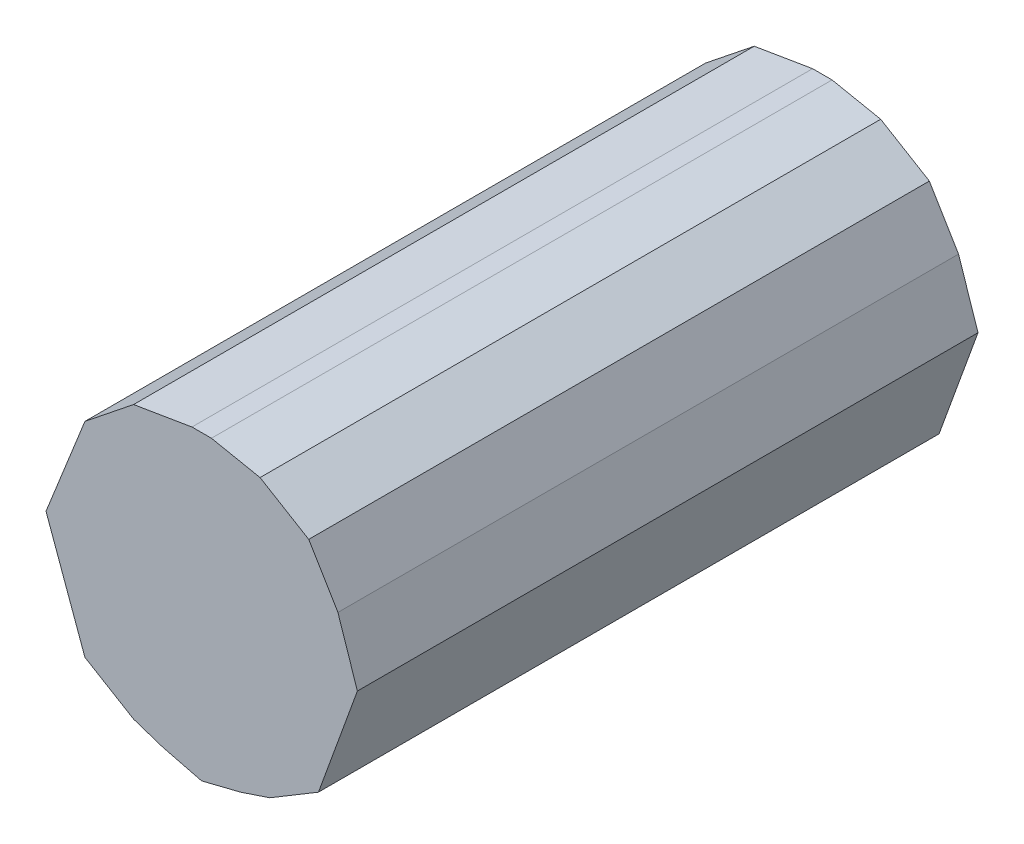
ISO-10303-21;
HEADER;
FILE_DESCRIPTION(('STEP AP214'),'2;1');
FILE_NAME('part.step','',(''),(''),'','','');
FILE_SCHEMA(('AUTOMOTIVE_DESIGN { 1 0 10303 214 1 1 1 1 }'));
ENDSEC;
DATA;
#1=APPLICATION_CONTEXT('core data for automotive mechanical design processes');
#2=APPLICATION_PROTOCOL_DEFINITION('international standard','automotive_design',2000,#1);
#3=PRODUCT_CONTEXT('',#1,'mechanical');
#4=PRODUCT('Part','Part','',(#3));
#5=PRODUCT_RELATED_PRODUCT_CATEGORY('part','',(#4));
#6=PRODUCT_DEFINITION_FORMATION('','',#4);
#7=PRODUCT_DEFINITION_CONTEXT('part definition',#1,'design');
#8=PRODUCT_DEFINITION('design','',#6,#7);
#9=PRODUCT_DEFINITION_SHAPE('','',#8);
#10=(LENGTH_UNIT() NAMED_UNIT(*) SI_UNIT(.MILLI.,.METRE.));
#11=(NAMED_UNIT(*) PLANE_ANGLE_UNIT() SI_UNIT($,.RADIAN.));
#12=(NAMED_UNIT(*) SI_UNIT($,.STERADIAN.) SOLID_ANGLE_UNIT());
#13=UNCERTAINTY_MEASURE_WITH_UNIT(LENGTH_MEASURE(1.E-05),#10,'distance_accuracy_value','');
#14=(GEOMETRIC_REPRESENTATION_CONTEXT(3) GLOBAL_UNCERTAINTY_ASSIGNED_CONTEXT((#13)) GLOBAL_UNIT_ASSIGNED_CONTEXT((#10,
#11,#12)) REPRESENTATION_CONTEXT('',''));
#15=CARTESIAN_POINT('',(0.,0.,0.));
#16=DIRECTION('',(0.,0.,1.));
#17=DIRECTION('',(1.,0.,0.));
#18=AXIS2_PLACEMENT_3D('',#15,#16,#17);
#19=CARTESIAN_POINT('',(-1.524,1.3335,0.));
#20=DIRECTION('',(0.928476690885259,-0.371390676354104,0.));
#21=DIRECTION('',(0.371390676354104,0.928476690885259,0.));
#22=AXIS2_PLACEMENT_3D('',#19,#20,#21);
#23=PLANE('',#22);
#24=DIRECTION('',(0.,0.,1.));
#25=VECTOR('',#24,1.);
#26=CARTESIAN_POINT('',(-2.032,0.0635,0.));
#27=LINE('',#26,#25);
#28=CARTESIAN_POINT('',(-2.032,0.0635,0.));
#29=VERTEX_POINT('',#28);
#30=CARTESIAN_POINT('',(-2.032,0.0635,8.1));
#31=VERTEX_POINT('',#30);
#32=EDGE_CURVE('E141',#29,#31,#27,.T.);
#33=ORIENTED_EDGE('',*,*,#32,.T.);
#34=DIRECTION('',(0.371390676354104,0.928476690885259,0.));
#35=VECTOR('',#34,1.);
#36=CARTESIAN_POINT('',(-1.524,1.3335,8.1));
#37=LINE('',#36,#35);
#38=CARTESIAN_POINT('',(-1.52400000000004,1.33350000000005,8.1));
#39=VERTEX_POINT('',#38);
#40=EDGE_CURVE('E20',#39,#31,#37,.F.);
#41=ORIENTED_EDGE('',*,*,#40,.F.);
#42=DIRECTION('',(0.,0.,1.));
#43=VECTOR('',#42,1.);
#44=CARTESIAN_POINT('',(-1.52400000000016,1.3335000000002,0.));
#45=LINE('',#44,#43);
#46=CARTESIAN_POINT('',(-1.52400000000004,1.33350000000005,0.));
#47=VERTEX_POINT('',#46);
#48=EDGE_CURVE('E151',#39,#47,#45,.F.);
#49=ORIENTED_EDGE('',*,*,#48,.T.);
#50=DIRECTION('',(0.371390676354104,0.928476690885259,0.));
#51=VECTOR('',#50,1.);
#52=CARTESIAN_POINT('',(-1.524,1.3335,0.));
#53=LINE('',#52,#51);
#54=EDGE_CURVE('E126',#29,#47,#53,.T.);
#55=ORIENTED_EDGE('',*,*,#54,.F.);
#56=EDGE_LOOP('',(#33,#41,#49,#55));
#57=FACE_BOUND('',#56,.T.);
#58=ADVANCED_FACE('F17',(#57),#23,.F.);
#59=CARTESIAN_POINT('',(-2.032,0.0635,0.));
#60=DIRECTION('',(0.939793423488291,0.341743063087106,0.));
#61=DIRECTION('',(-0.341743063087106,0.939793423488291,0.));
#62=AXIS2_PLACEMENT_3D('',#59,#60,#61);
#63=PLANE('',#62);
#64=DIRECTION('',(0.,0.,1.));
#65=VECTOR('',#64,1.);
#66=CARTESIAN_POINT('',(-1.524,-1.3335,0.));
#67=LINE('',#66,#65);
#68=CARTESIAN_POINT('',(-1.5239999999997,-1.33349999999989,0.));
#69=VERTEX_POINT('',#68);
#70=CARTESIAN_POINT('',(-1.5239999999997,-1.33349999999989,8.1));
#71=VERTEX_POINT('',#70);
#72=EDGE_CURVE('E144',#69,#71,#67,.T.);
#73=ORIENTED_EDGE('',*,*,#72,.T.);
#74=DIRECTION('',(-0.341743063087106,0.939793423488291,0.));
#75=VECTOR('',#74,1.);
#76=CARTESIAN_POINT('',(-2.032,0.0635,8.1));
#77=LINE('',#76,#75);
#78=EDGE_CURVE('E133',#31,#71,#77,.F.);
#79=ORIENTED_EDGE('',*,*,#78,.F.);
#80=ORIENTED_EDGE('',*,*,#32,.F.);
#81=DIRECTION('',(-0.341743063087106,0.939793423488291,0.));
#82=VECTOR('',#81,1.);
#83=CARTESIAN_POINT('',(-2.032,0.0635,0.));
#84=LINE('',#83,#82);
#85=EDGE_CURVE('E145',#69,#29,#84,.T.);
#86=ORIENTED_EDGE('',*,*,#85,.F.);
#87=EDGE_LOOP('',(#73,#79,#80,#86));
#88=FACE_BOUND('',#87,.T.);
#89=ADVANCED_FACE('F140',(#88),#63,.F.);
#90=CARTESIAN_POINT('',(-0.889,1.8415,0.));
#91=DIRECTION('',(0.62469504755418,-0.780868809443225,0.));
#92=DIRECTION('',(0.780868809443225,0.62469504755418,0.));
#93=AXIS2_PLACEMENT_3D('',#90,#91,#92);
#94=PLANE('',#93);
#95=ORIENTED_EDGE('',*,*,#48,.F.);
#96=DIRECTION('',(0.780868809443225,0.62469504755418,0.));
#97=VECTOR('',#96,1.);
#98=CARTESIAN_POINT('',(-0.889,1.8415,8.1));
#99=LINE('',#98,#97);
#100=CARTESIAN_POINT('',(-0.88900000000001,1.84150000000006,8.1));
#101=VERTEX_POINT('',#100);
#102=EDGE_CURVE('E136',#101,#39,#99,.F.);
#103=ORIENTED_EDGE('',*,*,#102,.F.);
#104=DIRECTION('',(0.,0.,1.));
#105=VECTOR('',#104,1.);
#106=CARTESIAN_POINT('',(-0.889000000000042,1.84150000000025,0.));
#107=LINE('',#106,#105);
#108=CARTESIAN_POINT('',(-0.88900000000001,1.84150000000006,0.));
#109=VERTEX_POINT('',#108);
#110=EDGE_CURVE('E163',#101,#109,#107,.F.);
#111=ORIENTED_EDGE('',*,*,#110,.T.);
#112=DIRECTION('',(0.780868809443225,0.62469504755418,0.));
#113=VECTOR('',#112,1.);
#114=CARTESIAN_POINT('',(-0.889,1.8415,0.));
#115=LINE('',#114,#113);
#116=EDGE_CURVE('E153',#47,#109,#115,.T.);
#117=ORIENTED_EDGE('',*,*,#116,.F.);
#118=EDGE_LOOP('',(#95,#103,#111,#117));
#119=FACE_BOUND('',#118,.T.);
#120=ADVANCED_FACE('F321',(#119),#94,.F.);
#121=CARTESIAN_POINT('',(-1.524,-1.3335,0.));
#122=DIRECTION('',(0.514495755428115,0.857492925712191,0.));
#123=DIRECTION('',(-0.857492925712191,0.514495755428115,0.));
#124=AXIS2_PLACEMENT_3D('',#121,#122,#123);
#125=PLANE('',#124);
#126=DIRECTION('',(0.,0.,1.));
#127=VECTOR('',#126,1.);
#128=CARTESIAN_POINT('',(-0.889,-1.7145,0.));
#129=LINE('',#128,#127);
#130=CARTESIAN_POINT('',(-0.88900000000013,-1.71450000000022,0.));
#131=VERTEX_POINT('',#130);
#132=CARTESIAN_POINT('',(-0.88900000000013,-1.71450000000022,8.1));
#133=VERTEX_POINT('',#132);
#134=EDGE_CURVE('E168',#131,#133,#129,.T.);
#135=ORIENTED_EDGE('',*,*,#134,.T.);
#136=DIRECTION('',(-0.857492925712191,0.514495755428115,0.));
#137=VECTOR('',#136,1.);
#138=CARTESIAN_POINT('',(-1.524,-1.3335,8.1));
#139=LINE('',#138,#137);
#140=EDGE_CURVE('E156',#71,#133,#139,.F.);
#141=ORIENTED_EDGE('',*,*,#140,.F.);
#142=ORIENTED_EDGE('',*,*,#72,.F.);
#143=DIRECTION('',(-0.857492925712191,0.514495755428115,0.));
#144=VECTOR('',#143,1.);
#145=CARTESIAN_POINT('',(-1.524,-1.3335,0.));
#146=LINE('',#145,#144);
#147=EDGE_CURVE('E158',#131,#69,#146,.T.);
#148=ORIENTED_EDGE('',*,*,#147,.F.);
#149=EDGE_LOOP('',(#135,#141,#142,#148));
#150=FACE_BOUND('',#149,.T.);
#151=ADVANCED_FACE('F317',(#150),#125,.F.);
#152=CARTESIAN_POINT('',(-0.127,1.9685,0.));
#153=DIRECTION('',(0.164398987305033,-0.986393923832198,0.));
#154=DIRECTION('',(0.986393923832198,0.164398987305033,0.));
#155=AXIS2_PLACEMENT_3D('',#152,#153,#154);
#156=PLANE('',#155);
#157=ORIENTED_EDGE('',*,*,#110,.F.);
#158=DIRECTION('',(0.986393923832198,0.164398987305033,0.));
#159=VECTOR('',#158,1.);
#160=CARTESIAN_POINT('',(-0.127,1.9685,8.1));
#161=LINE('',#160,#159);
#162=CARTESIAN_POINT('',(-0.127000000000001,1.9685,8.1));
#163=VERTEX_POINT('',#162);
#164=EDGE_CURVE('E161',#163,#101,#161,.F.);
#165=ORIENTED_EDGE('',*,*,#164,.F.);
#166=DIRECTION('',(0.,0.,-1.));
#167=VECTOR('',#166,1.);
#168=CARTESIAN_POINT('',(-0.127,1.9685,0.));
#169=LINE('',#168,#167);
#170=CARTESIAN_POINT('',(-0.127000000000001,1.9685,0.));
#171=VERTEX_POINT('',#170);
#172=EDGE_CURVE('E179',#163,#171,#169,.T.);
#173=ORIENTED_EDGE('',*,*,#172,.T.);
#174=DIRECTION('',(0.986393923832198,0.164398987305033,0.));
#175=VECTOR('',#174,1.);
#176=CARTESIAN_POINT('',(-0.127,1.9685,0.));
#177=LINE('',#176,#175);
#178=EDGE_CURVE('E166',#109,#171,#177,.T.);
#179=ORIENTED_EDGE('',*,*,#178,.F.);
#180=EDGE_LOOP('',(#157,#165,#173,#179));
#181=FACE_BOUND('',#180,.T.);
#182=ADVANCED_FACE('F313',(#181),#156,.F.);
#183=CARTESIAN_POINT('',(-0.889,-1.7145,0.));
#184=DIRECTION('',(0.316227766016838,0.948683298050514,0.));
#185=DIRECTION('',(-0.948683298050514,0.316227766016838,0.));
#186=AXIS2_PLACEMENT_3D('',#183,#184,#185);
#187=PLANE('',#186);
#188=DIRECTION('',(0.,0.,1.));
#189=VECTOR('',#188,1.);
#190=CARTESIAN_POINT('',(-0.508,-1.8415,0.));
#191=LINE('',#190,#189);
#192=CARTESIAN_POINT('',(-0.507999999999996,-1.8415,0.));
#193=VERTEX_POINT('',#192);
#194=CARTESIAN_POINT('',(-0.507999999999996,-1.8415,8.1));
#195=VERTEX_POINT('',#194);
#196=EDGE_CURVE('E184',#193,#195,#191,.T.);
#197=ORIENTED_EDGE('',*,*,#196,.T.);
#198=DIRECTION('',(-0.948683298050514,0.316227766016838,0.));
#199=VECTOR('',#198,1.);
#200=CARTESIAN_POINT('',(-0.889,-1.7145,8.1));
#201=LINE('',#200,#199);
#202=EDGE_CURVE('E171',#133,#195,#201,.F.);
#203=ORIENTED_EDGE('',*,*,#202,.F.);
#204=ORIENTED_EDGE('',*,*,#134,.F.);
#205=DIRECTION('',(-0.948683298050514,0.316227766016838,0.));
#206=VECTOR('',#205,1.);
#207=CARTESIAN_POINT('',(-0.889,-1.7145,0.));
#208=LINE('',#207,#206);
#209=EDGE_CURVE('E173',#193,#131,#208,.T.);
#210=ORIENTED_EDGE('',*,*,#209,.F.);
#211=EDGE_LOOP('',(#197,#203,#204,#210));
#212=FACE_BOUND('',#211,.T.);
#213=ADVANCED_FACE('F309',(#212),#187,.F.);
#214=CARTESIAN_POINT('',(0.127,1.9685,0.));
#215=DIRECTION('',(0.,-1.,0.));
#216=DIRECTION('',(0.,0.,-1.));
#217=AXIS2_PLACEMENT_3D('',#214,#215,#216);
#218=PLANE('',#217);
#219=ORIENTED_EDGE('',*,*,#172,.F.);
#220=DIRECTION('',(1.,0.,0.));
#221=VECTOR('',#220,1.);
#222=CARTESIAN_POINT('',(0.127,1.9685,8.1));
#223=LINE('',#222,#221);
#224=CARTESIAN_POINT('',(0.126999999999994,1.96849999999997,8.1));
#225=VERTEX_POINT('',#224);
#226=EDGE_CURVE('E176',#225,#163,#223,.F.);
#227=ORIENTED_EDGE('',*,*,#226,.F.);
#228=DIRECTION('',(0.,0.,1.));
#229=VECTOR('',#228,1.);
#230=CARTESIAN_POINT('',(0.126999999999975,1.96849999999988,0.));
#231=LINE('',#230,#229);
#232=CARTESIAN_POINT('',(0.126999999999994,1.96849999999997,0.));
#233=VERTEX_POINT('',#232);
#234=EDGE_CURVE('E195',#225,#233,#231,.F.);
#235=ORIENTED_EDGE('',*,*,#234,.T.);
#236=DIRECTION('',(1.,0.,0.));
#237=VECTOR('',#236,1.);
#238=CARTESIAN_POINT('',(0.127,1.9685,0.));
#239=LINE('',#238,#237);
#240=EDGE_CURVE('E182',#171,#233,#239,.T.);
#241=ORIENTED_EDGE('',*,*,#240,.F.);
#242=EDGE_LOOP('',(#219,#227,#235,#241));
#243=FACE_BOUND('',#242,.T.);
#244=ADVANCED_FACE('F305',(#243),#218,.F.);
#245=CARTESIAN_POINT('',(-0.508,-1.8415,0.));
#246=DIRECTION('',(0.242535625036098,0.970142500145391,0.));
#247=DIRECTION('',(-0.970142500145391,0.242535625036098,0.));
#248=AXIS2_PLACEMENT_3D('',#245,#246,#247);
#249=PLANE('',#248);
#250=DIRECTION('',(0.,0.,1.));
#251=VECTOR('',#250,1.);
#252=CARTESIAN_POINT('',(0.,-1.9685,0.));
#253=LINE('',#252,#251);
#254=CARTESIAN_POINT('',(0.,-1.96849999999994,0.));
#255=VERTEX_POINT('',#254);
#256=CARTESIAN_POINT('',(0.,-1.96849999999994,8.1));
#257=VERTEX_POINT('',#256);
#258=EDGE_CURVE('E200',#255,#257,#253,.T.);
#259=ORIENTED_EDGE('',*,*,#258,.T.);
#260=DIRECTION('',(-0.970142500145391,0.242535625036098,0.));
#261=VECTOR('',#260,1.);
#262=CARTESIAN_POINT('',(-0.508,-1.8415,8.1));
#263=LINE('',#262,#261);
#264=EDGE_CURVE('E187',#195,#257,#263,.F.);
#265=ORIENTED_EDGE('',*,*,#264,.F.);
#266=ORIENTED_EDGE('',*,*,#196,.F.);
#267=DIRECTION('',(-0.970142500145391,0.242535625036098,0.));
#268=VECTOR('',#267,1.);
#269=CARTESIAN_POINT('',(-0.508,-1.8415,0.));
#270=LINE('',#269,#268);
#271=EDGE_CURVE('E189',#255,#193,#270,.T.);
#272=ORIENTED_EDGE('',*,*,#271,.F.);
#273=EDGE_LOOP('',(#259,#265,#266,#272));
#274=FACE_BOUND('',#273,.T.);
#275=ADVANCED_FACE('F301',(#274),#249,.F.);
#276=CARTESIAN_POINT('',(0.762,1.8415,0.));
#277=DIRECTION('',(-0.196116135137992,-0.980580675690959,0.));
#278=DIRECTION('',(0.980580675690959,-0.196116135137992,0.));
#279=AXIS2_PLACEMENT_3D('',#276,#277,#278);
#280=PLANE('',#279);
#281=ORIENTED_EDGE('',*,*,#234,.F.);
#282=DIRECTION('',(0.980580675690959,-0.196116135137992,0.));
#283=VECTOR('',#282,1.);
#284=CARTESIAN_POINT('',(0.762,1.8415,8.1));
#285=LINE('',#284,#283);
#286=CARTESIAN_POINT('',(0.762000000000065,1.84150000000011,8.1));
#287=VERTEX_POINT('',#286);
#288=EDGE_CURVE('E192',#287,#225,#285,.F.);
#289=ORIENTED_EDGE('',*,*,#288,.F.);
#290=DIRECTION('',(0.,0.,1.));
#291=VECTOR('',#290,1.);
#292=CARTESIAN_POINT('',(0.762000000000261,1.84150000000044,0.));
#293=LINE('',#292,#291);
#294=CARTESIAN_POINT('',(0.762000000000065,1.84150000000011,0.));
#295=VERTEX_POINT('',#294);
#296=EDGE_CURVE('E211',#287,#295,#293,.F.);
#297=ORIENTED_EDGE('',*,*,#296,.T.);
#298=DIRECTION('',(0.980580675690959,-0.196116135137992,0.));
#299=VECTOR('',#298,1.);
#300=CARTESIAN_POINT('',(0.762,1.8415,0.));
#301=LINE('',#300,#299);
#302=EDGE_CURVE('E198',#233,#295,#301,.T.);
#303=ORIENTED_EDGE('',*,*,#302,.F.);
#304=EDGE_LOOP('',(#281,#289,#297,#303));
#305=FACE_BOUND('',#304,.T.);
#306=ADVANCED_FACE('F297',(#305),#280,.F.);
#307=CARTESIAN_POINT('',(0.,-1.9685,0.));
#308=DIRECTION('',(-0.242535625036098,0.970142500145391,0.));
#309=DIRECTION('',(-0.970142500145391,-0.242535625036098,0.));
#310=AXIS2_PLACEMENT_3D('',#307,#308,#309);
#311=PLANE('',#310);
#312=DIRECTION('',(0.,0.,1.));
#313=VECTOR('',#312,1.);
#314=CARTESIAN_POINT('',(0.508,-1.8415,0.));
#315=LINE('',#314,#313);
#316=CARTESIAN_POINT('',(0.508000000000018,-1.84150000000006,0.));
#317=VERTEX_POINT('',#316);
#318=CARTESIAN_POINT('',(0.508000000000017,-1.84150000000006,8.1));
#319=VERTEX_POINT('',#318);
#320=EDGE_CURVE('E216',#317,#319,#315,.T.);
#321=ORIENTED_EDGE('',*,*,#320,.T.);
#322=DIRECTION('',(-0.970142500145391,-0.242535625036098,0.));
#323=VECTOR('',#322,1.);
#324=CARTESIAN_POINT('',(0.,-1.9685,8.1));
#325=LINE('',#324,#323);
#326=EDGE_CURVE('E203',#257,#319,#325,.F.);
#327=ORIENTED_EDGE('',*,*,#326,.F.);
#328=ORIENTED_EDGE('',*,*,#258,.F.);
#329=DIRECTION('',(-0.970142500145391,-0.242535625036098,0.));
#330=VECTOR('',#329,1.);
#331=CARTESIAN_POINT('',(0.,-1.9685,0.));
#332=LINE('',#331,#330);
#333=EDGE_CURVE('E205',#317,#255,#332,.T.);
#334=ORIENTED_EDGE('',*,*,#333,.F.);
#335=EDGE_LOOP('',(#321,#327,#328,#334));
#336=FACE_BOUND('',#335,.T.);
#337=ADVANCED_FACE('F293',(#336),#311,.F.);
#338=CARTESIAN_POINT('',(1.397,1.4605,0.));
#339=DIRECTION('',(-0.514495755428115,-0.857492925712191,0.));
#340=DIRECTION('',(0.857492925712191,-0.514495755428115,0.));
#341=AXIS2_PLACEMENT_3D('',#338,#339,#340);
#342=PLANE('',#341);
#343=ORIENTED_EDGE('',*,*,#296,.F.);
#344=DIRECTION('',(0.857492925712191,-0.514495755428115,0.));
#345=VECTOR('',#344,1.);
#346=CARTESIAN_POINT('',(1.397,1.4605,8.1));
#347=LINE('',#346,#345);
#348=CARTESIAN_POINT('',(1.39699999999989,1.46049999999993,8.1));
#349=VERTEX_POINT('',#348);
#350=EDGE_CURVE('E208',#349,#287,#347,.F.);
#351=ORIENTED_EDGE('',*,*,#350,.F.);
#352=DIRECTION('',(0.,0.,1.));
#353=VECTOR('',#352,1.);
#354=CARTESIAN_POINT('',(1.39699999999956,1.46049999999974,0.));
#355=LINE('',#354,#353);
#356=CARTESIAN_POINT('',(1.39699999999989,1.46049999999993,0.));
#357=VERTEX_POINT('',#356);
#358=EDGE_CURVE('E224',#349,#357,#355,.F.);
#359=ORIENTED_EDGE('',*,*,#358,.T.);
#360=DIRECTION('',(0.857492925712191,-0.514495755428115,0.));
#361=VECTOR('',#360,1.);
#362=CARTESIAN_POINT('',(1.397,1.4605,0.));
#363=LINE('',#362,#361);
#364=EDGE_CURVE('E214',#295,#357,#363,.T.);
#365=ORIENTED_EDGE('',*,*,#364,.F.);
#366=EDGE_LOOP('',(#343,#351,#359,#365));
#367=FACE_BOUND('',#366,.T.);
#368=ADVANCED_FACE('F289',(#367),#342,.F.);
#369=CARTESIAN_POINT('',(0.508,-1.8415,0.));
#370=DIRECTION('',(-0.316227766016838,0.948683298050514,0.));
#371=DIRECTION('',(-0.948683298050514,-0.316227766016838,0.));
#372=AXIS2_PLACEMENT_3D('',#369,#370,#371);
#373=PLANE('',#372);
#374=DIRECTION('',(0.,0.,1.));
#375=VECTOR('',#374,1.);
#376=CARTESIAN_POINT('',(0.889,-1.7145,0.));
#377=LINE('',#376,#375);
#378=CARTESIAN_POINT('',(0.889000000000001,-1.7145,0.));
#379=VERTEX_POINT('',#378);
#380=CARTESIAN_POINT('',(0.889000000000001,-1.7145,8.1));
#381=VERTEX_POINT('',#380);
#382=EDGE_CURVE('E229',#379,#381,#377,.T.);
#383=ORIENTED_EDGE('',*,*,#382,.T.);
#384=DIRECTION('',(-0.948683298050514,-0.316227766016838,0.));
#385=VECTOR('',#384,1.);
#386=CARTESIAN_POINT('',(0.508,-1.8415,8.1));
#387=LINE('',#386,#385);
#388=EDGE_CURVE('E219',#319,#381,#387,.F.);
#389=ORIENTED_EDGE('',*,*,#388,.F.);
#390=ORIENTED_EDGE('',*,*,#320,.F.);
#391=DIRECTION('',(-0.948683298050514,-0.316227766016838,0.));
#392=VECTOR('',#391,1.);
#393=CARTESIAN_POINT('',(0.508,-1.8415,0.));
#394=LINE('',#393,#392);
#395=EDGE_CURVE('E221',#379,#317,#394,.T.);
#396=ORIENTED_EDGE('',*,*,#395,.F.);
#397=EDGE_LOOP('',(#383,#389,#390,#396));
#398=FACE_BOUND('',#397,.T.);
#399=ADVANCED_FACE('F285',(#398),#373,.F.);
#400=CARTESIAN_POINT('',(1.778,0.8255,0.));
#401=DIRECTION('',(-0.857492925712191,-0.514495755428115,0.));
#402=DIRECTION('',(0.514495755428115,-0.857492925712191,0.));
#403=AXIS2_PLACEMENT_3D('',#400,#401,#402);
#404=PLANE('',#403);
#405=ORIENTED_EDGE('',*,*,#358,.F.);
#406=DIRECTION('',(0.514495755427527,-0.857492925712544,0.));
#407=VECTOR('',#406,1.);
#408=CARTESIAN_POINT('',(1.397,1.4605,8.1));
#409=LINE('',#408,#407);
#410=CARTESIAN_POINT('',(1.778,0.8255,8.1));
#411=VERTEX_POINT('',#410);
#412=EDGE_CURVE('E232',#349,#411,#409,.T.);
#413=ORIENTED_EDGE('',*,*,#412,.T.);
#414=DIRECTION('',(0.,0.,1.));
#415=VECTOR('',#414,1.);
#416=CARTESIAN_POINT('',(1.778,0.8255,0.));
#417=LINE('',#416,#415);
#418=CARTESIAN_POINT('',(1.778,0.8255,0.));
#419=VERTEX_POINT('',#418);
#420=EDGE_CURVE('E240',#411,#419,#417,.F.);
#421=ORIENTED_EDGE('',*,*,#420,.T.);
#422=DIRECTION('',(0.514495755428115,-0.857492925712191,0.));
#423=VECTOR('',#422,1.);
#424=CARTESIAN_POINT('',(1.778,0.8255,0.));
#425=LINE('',#424,#423);
#426=EDGE_CURVE('E227',#357,#419,#425,.T.);
#427=ORIENTED_EDGE('',*,*,#426,.F.);
#428=EDGE_LOOP('',(#405,#413,#421,#427));
#429=FACE_BOUND('',#428,.T.);
#430=ADVANCED_FACE('F282',(#429),#404,.F.);
#431=CARTESIAN_POINT('',(0.889,-1.7145,0.));
#432=DIRECTION('',(-0.514495755428115,0.857492925712191,0.));
#433=DIRECTION('',(-0.857492925712191,-0.514495755428115,0.));
#434=AXIS2_PLACEMENT_3D('',#431,#432,#433);
#435=PLANE('',#434);
#436=DIRECTION('',(0.,0.,1.));
#437=VECTOR('',#436,1.);
#438=CARTESIAN_POINT('',(1.524,-1.3335,0.));
#439=LINE('',#438,#437);
#440=CARTESIAN_POINT('',(1.52399999999987,-1.33349999999978,0.));
#441=VERTEX_POINT('',#440);
#442=CARTESIAN_POINT('',(1.52399999999987,-1.33349999999978,8.1));
#443=VERTEX_POINT('',#442);
#444=EDGE_CURVE('E247',#441,#443,#439,.T.);
#445=ORIENTED_EDGE('',*,*,#444,.T.);
#446=DIRECTION('',(-0.857492925712544,-0.514495755427527,0.));
#447=VECTOR('',#446,1.);
#448=CARTESIAN_POINT('',(1.524,-1.3335,8.1));
#449=LINE('',#448,#447);
#450=EDGE_CURVE('E234',#443,#381,#449,.T.);
#451=ORIENTED_EDGE('',*,*,#450,.T.);
#452=ORIENTED_EDGE('',*,*,#382,.F.);
#453=DIRECTION('',(-0.857492925712544,-0.514495755427527,0.));
#454=VECTOR('',#453,1.);
#455=CARTESIAN_POINT('',(1.524,-1.3335,0.));
#456=LINE('',#455,#454);
#457=EDGE_CURVE('E244',#441,#379,#456,.T.);
#458=ORIENTED_EDGE('',*,*,#457,.F.);
#459=EDGE_LOOP('',(#445,#451,#452,#458));
#460=FACE_BOUND('',#459,.T.);
#461=ADVANCED_FACE('F265',(#460),#435,.F.);
#462=CARTESIAN_POINT('',(0.508,-1.8415,8.1));
#463=DIRECTION('',(0.,0.,-1.));
#464=DIRECTION('',(-1.,0.,0.));
#465=AXIS2_PLACEMENT_3D('',#462,#463,#464);
#466=PLANE('',#465);
#467=ORIENTED_EDGE('',*,*,#450,.F.);
#468=DIRECTION('',(-0.341743063087106,-0.939793423488291,0.));
#469=VECTOR('',#468,1.);
#470=CARTESIAN_POINT('',(1.524,-1.3335,8.1));
#471=LINE('',#470,#469);
#472=CARTESIAN_POINT('',(2.03200000000015,0.0634999999999457,8.1));
#473=VERTEX_POINT('',#472);
#474=EDGE_CURVE('E250',#443,#473,#471,.F.);
#475=ORIENTED_EDGE('',*,*,#474,.T.);
#476=DIRECTION('',(0.316227766016838,-0.948683298050514,0.));
#477=VECTOR('',#476,1.);
#478=CARTESIAN_POINT('',(2.032,0.0635,8.1));
#479=LINE('',#478,#477);
#480=EDGE_CURVE('E237',#473,#411,#479,.F.);
#481=ORIENTED_EDGE('',*,*,#480,.T.);
#482=ORIENTED_EDGE('',*,*,#412,.F.);
#483=ORIENTED_EDGE('',*,*,#350,.T.);
#484=ORIENTED_EDGE('',*,*,#288,.T.);
#485=ORIENTED_EDGE('',*,*,#226,.T.);
#486=ORIENTED_EDGE('',*,*,#164,.T.);
#487=ORIENTED_EDGE('',*,*,#102,.T.);
#488=ORIENTED_EDGE('',*,*,#40,.T.);
#489=ORIENTED_EDGE('',*,*,#78,.T.);
#490=ORIENTED_EDGE('',*,*,#140,.T.);
#491=ORIENTED_EDGE('',*,*,#202,.T.);
#492=ORIENTED_EDGE('',*,*,#264,.T.);
#493=ORIENTED_EDGE('',*,*,#326,.T.);
#494=ORIENTED_EDGE('',*,*,#388,.T.);
#495=EDGE_LOOP('',(#467,#475,#481,#482,#483,#484,#485,#486,#487,#488,#489,#490,#491,#492,#493,#494));
#496=FACE_BOUND('',#495,.T.);
#497=ADVANCED_FACE('F132',(#496),#466,.F.);
#498=CARTESIAN_POINT('',(2.032,0.0635,0.));
#499=DIRECTION('',(-0.948683298050514,-0.316227766016838,0.));
#500=DIRECTION('',(0.316227766016838,-0.948683298050514,0.));
#501=AXIS2_PLACEMENT_3D('',#498,#499,#500);
#502=PLANE('',#501);
#503=ORIENTED_EDGE('',*,*,#420,.F.);
#504=ORIENTED_EDGE('',*,*,#480,.F.);
#505=DIRECTION('',(0.,0.,1.));
#506=VECTOR('',#505,1.);
#507=CARTESIAN_POINT('',(2.0320000000006,0.0634999999997831,0.));
#508=LINE('',#507,#506);
#509=CARTESIAN_POINT('',(2.03200000000015,0.0634999999999457,0.));
#510=VERTEX_POINT('',#509);
#511=EDGE_CURVE('E26',#473,#510,#508,.F.);
#512=ORIENTED_EDGE('',*,*,#511,.T.);
#513=DIRECTION('',(0.316227766016838,-0.948683298050514,0.));
#514=VECTOR('',#513,1.);
#515=CARTESIAN_POINT('',(1.778,0.8255,0.));
#516=LINE('',#515,#514);
#517=EDGE_CURVE('E34',#419,#510,#516,.T.);
#518=ORIENTED_EDGE('',*,*,#517,.F.);
#519=EDGE_LOOP('',(#503,#504,#512,#518));
#520=FACE_BOUND('',#519,.T.);
#521=ADVANCED_FACE('F257',(#520),#502,.F.);
#522=CARTESIAN_POINT('',(0.508,-1.8415,0.));
#523=DIRECTION('',(0.,0.,-1.));
#524=DIRECTION('',(-1.,0.,0.));
#525=AXIS2_PLACEMENT_3D('',#522,#523,#524);
#526=PLANE('',#525);
#527=ORIENTED_EDGE('',*,*,#457,.T.);
#528=ORIENTED_EDGE('',*,*,#395,.T.);
#529=ORIENTED_EDGE('',*,*,#333,.T.);
#530=ORIENTED_EDGE('',*,*,#271,.T.);
#531=ORIENTED_EDGE('',*,*,#209,.T.);
#532=ORIENTED_EDGE('',*,*,#147,.T.);
#533=ORIENTED_EDGE('',*,*,#85,.T.);
#534=ORIENTED_EDGE('',*,*,#54,.T.);
#535=ORIENTED_EDGE('',*,*,#116,.T.);
#536=ORIENTED_EDGE('',*,*,#178,.T.);
#537=ORIENTED_EDGE('',*,*,#240,.T.);
#538=ORIENTED_EDGE('',*,*,#302,.T.);
#539=ORIENTED_EDGE('',*,*,#364,.T.);
#540=ORIENTED_EDGE('',*,*,#426,.T.);
#541=ORIENTED_EDGE('',*,*,#517,.T.);
#542=DIRECTION('',(-0.341743063087106,-0.939793423488291,0.));
#543=VECTOR('',#542,1.);
#544=CARTESIAN_POINT('',(1.524,-1.3335,0.));
#545=LINE('',#544,#543);
#546=EDGE_CURVE('E11',#510,#441,#545,.T.);
#547=ORIENTED_EDGE('',*,*,#546,.T.);
#548=EDGE_LOOP('',(#527,#528,#529,#530,#531,#532,#533,#534,#535,#536,#537,#538,#539,#540,#541,#547));
#549=FACE_BOUND('',#548,.T.);
#550=ADVANCED_FACE('F267',(#549),#526,.T.);
#551=CARTESIAN_POINT('',(1.524,-1.3335,0.));
#552=DIRECTION('',(-0.939793423488291,0.341743063087106,0.));
#553=DIRECTION('',(-0.341743063087106,-0.939793423488291,0.));
#554=AXIS2_PLACEMENT_3D('',#551,#552,#553);
#555=PLANE('',#554);
#556=ORIENTED_EDGE('',*,*,#511,.F.);
#557=ORIENTED_EDGE('',*,*,#474,.F.);
#558=ORIENTED_EDGE('',*,*,#444,.F.);
#559=ORIENTED_EDGE('',*,*,#546,.F.);
#560=EDGE_LOOP('',(#556,#557,#558,#559));
#561=FACE_BOUND('',#560,.T.);
#562=ADVANCED_FACE('F260',(#561),#555,.F.);
#563=CLOSED_SHELL('',(#58,#89,#120,#151,#182,#213,#244,#275,#306,#337,#368,#399,#430,#461,#497,
#521,#550,#562));
#564=MANIFOLD_SOLID_BREP('B1',#563);
#565=ADVANCED_BREP_SHAPE_REPRESENTATION('',(#18,#564),#14);
#566=SHAPE_DEFINITION_REPRESENTATION(#9,#565);
ENDSEC;
END-ISO-10303-21;
